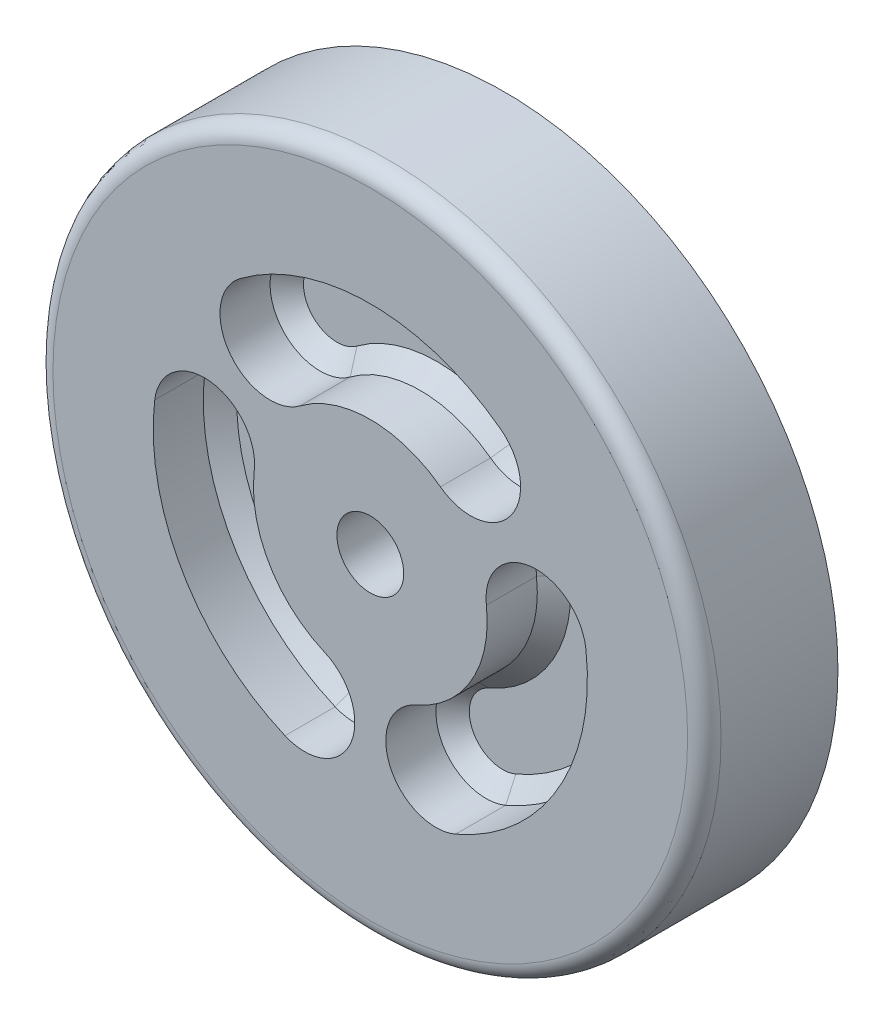
ISO-10303-21;
HEADER;
FILE_DESCRIPTION(('STEP AP214'),'2;1');
FILE_NAME('part.step','',(''),(''),'','','');
FILE_SCHEMA(('AUTOMOTIVE_DESIGN { 1 0 10303 214 1 1 1 1 }'));
ENDSEC;
DATA;
#1=APPLICATION_CONTEXT('core data for automotive mechanical design processes');
#2=APPLICATION_PROTOCOL_DEFINITION('international standard','automotive_design',2000,#1);
#3=PRODUCT_CONTEXT('',#1,'mechanical');
#4=PRODUCT('Part','Part','',(#3));
#5=PRODUCT_RELATED_PRODUCT_CATEGORY('part','',(#4));
#6=PRODUCT_DEFINITION_FORMATION('','',#4);
#7=PRODUCT_DEFINITION_CONTEXT('part definition',#1,'design');
#8=PRODUCT_DEFINITION('design','',#6,#7);
#9=PRODUCT_DEFINITION_SHAPE('','',#8);
#10=(LENGTH_UNIT() NAMED_UNIT(*) SI_UNIT(.MILLI.,.METRE.));
#11=(NAMED_UNIT(*) PLANE_ANGLE_UNIT() SI_UNIT($,.RADIAN.));
#12=(NAMED_UNIT(*) SI_UNIT($,.STERADIAN.) SOLID_ANGLE_UNIT());
#13=UNCERTAINTY_MEASURE_WITH_UNIT(LENGTH_MEASURE(1.E-05),#10,'distance_accuracy_value','');
#14=(GEOMETRIC_REPRESENTATION_CONTEXT(3) GLOBAL_UNCERTAINTY_ASSIGNED_CONTEXT((#13)) GLOBAL_UNIT_ASSIGNED_CONTEXT((#10,
#11,#12)) REPRESENTATION_CONTEXT('',''));
#15=CARTESIAN_POINT('',(0.,0.,0.));
#16=DIRECTION('',(0.,0.,1.));
#17=DIRECTION('',(1.,0.,0.));
#18=AXIS2_PLACEMENT_3D('',#15,#16,#17);
#19=CARTESIAN_POINT('',(0.,0.,40.));
#20=DIRECTION('',(0.,0.,-1.));
#21=DIRECTION('',(-1.,0.,0.));
#22=AXIS2_PLACEMENT_3D('',#19,#20,#21);
#23=CYLINDRICAL_SURFACE('',#22,100.);
#24=CARTESIAN_POINT('',(0.,0.,35.));
#25=DIRECTION('',(0.,0.,1.));
#26=DIRECTION('',(1.,0.,0.));
#27=AXIS2_PLACEMENT_3D('',#24,#25,#26);
#28=CIRCLE('',#27,100.);
#29=CARTESIAN_POINT('',(100.,0.,35.));
#30=VERTEX_POINT('',#29);
#31=EDGE_CURVE('E267',#30,#30,#28,.F.);
#32=ORIENTED_EDGE('',*,*,#31,.T.);
#33=EDGE_LOOP('',(#32));
#34=FACE_BOUND('',#33,.T.);
#35=CARTESIAN_POINT('',(0.,0.,0.));
#36=DIRECTION('',(0.,0.,1.));
#37=DIRECTION('',(1.,0.,0.));
#38=AXIS2_PLACEMENT_3D('',#35,#36,#37);
#39=CIRCLE('',#38,100.);
#40=CARTESIAN_POINT('',(100.,0.,0.));
#41=VERTEX_POINT('',#40);
#42=EDGE_CURVE('E198',#41,#41,#39,.T.);
#43=ORIENTED_EDGE('',*,*,#42,.T.);
#44=EDGE_LOOP('',(#43));
#45=FACE_BOUND('',#44,.T.);
#46=ADVANCED_FACE('F41',(#34,#45),#23,.T.);
#47=CARTESIAN_POINT('',(0.,0.,40.));
#48=DIRECTION('',(0.,0.,1.));
#49=DIRECTION('',(1.,0.,0.));
#50=AXIS2_PLACEMENT_3D('',#47,#48,#49);
#51=PLANE('',#50);
#52=CARTESIAN_POINT('',(0.,0.,40.));
#53=DIRECTION('',(0.,0.,1.));
#54=DIRECTION('',(1.,0.,0.));
#55=AXIS2_PLACEMENT_3D('',#52,#53,#54);
#56=CIRCLE('',#55,10.);
#57=CARTESIAN_POINT('',(10.,0.,40.));
#58=VERTEX_POINT('',#57);
#59=EDGE_CURVE('E749',#58,#58,#56,.T.);
#60=ORIENTED_EDGE('',*,*,#59,.F.);
#61=EDGE_LOOP('',(#60));
#62=FACE_BOUND('',#61,.T.);
#63=CARTESIAN_POINT('',(0.,0.,40.));
#64=DIRECTION('',(0.,0.,1.));
#65=DIRECTION('',(1.,0.,0.));
#66=AXIS2_PLACEMENT_3D('',#63,#64,#65);
#67=CIRCLE('',#66,95.);
#68=CARTESIAN_POINT('',(95.,0.,40.));
#69=VERTEX_POINT('',#68);
#70=EDGE_CURVE('E263',#69,#69,#67,.T.);
#71=ORIENTED_EDGE('',*,*,#70,.T.);
#72=EDGE_LOOP('',(#71));
#73=FACE_BOUND('',#72,.T.);
#74=CARTESIAN_POINT('',(30.,40.,40.));
#75=DIRECTION('',(0.,0.,1.));
#76=DIRECTION('',(1.,0.,0.));
#77=AXIS2_PLACEMENT_3D('',#74,#75,#76);
#78=CIRCLE('',#77,15.);
#79=CARTESIAN_POINT('',(21.,28.,40.));
#80=VERTEX_POINT('',#79);
#81=CARTESIAN_POINT('',(39.,52.,40.));
#82=VERTEX_POINT('',#81);
#83=EDGE_CURVE('E183',#80,#82,#78,.T.);
#84=ORIENTED_EDGE('',*,*,#83,.F.);
#85=CARTESIAN_POINT('',(0.,0.,40.));
#86=DIRECTION('',(0.,0.,-1.));
#87=DIRECTION('',(1.,0.,0.));
#88=AXIS2_PLACEMENT_3D('',#85,#86,#87);
#89=CIRCLE('',#88,35.);
#90=CARTESIAN_POINT('',(-21.,28.,40.));
#91=VERTEX_POINT('',#90);
#92=EDGE_CURVE('E188',#91,#80,#89,.T.);
#93=ORIENTED_EDGE('',*,*,#92,.F.);
#94=CARTESIAN_POINT('',(-30.,40.,40.));
#95=DIRECTION('',(0.,0.,1.));
#96=DIRECTION('',(1.,0.,0.));
#97=AXIS2_PLACEMENT_3D('',#94,#95,#96);
#98=CIRCLE('',#97,15.);
#99=CARTESIAN_POINT('',(-39.,52.,40.));
#100=VERTEX_POINT('',#99);
#101=EDGE_CURVE('E170',#100,#91,#98,.T.);
#102=ORIENTED_EDGE('',*,*,#101,.F.);
#103=CARTESIAN_POINT('',(0.,0.,40.));
#104=DIRECTION('',(0.,0.,1.));
#105=DIRECTION('',(1.,0.,0.));
#106=AXIS2_PLACEMENT_3D('',#103,#104,#105);
#107=CIRCLE('',#106,65.);
#108=EDGE_CURVE('E177',#82,#100,#107,.T.);
#109=ORIENTED_EDGE('',*,*,#108,.F.);
#110=EDGE_LOOP('',(#84,#93,#102,#109));
#111=FACE_BOUND('',#110,.T.);
#112=CARTESIAN_POINT('',(19.6410161513776,-45.9807621135332,40.));
#113=DIRECTION('',(0.,0.,1.));
#114=DIRECTION('',(1.,0.,0.));
#115=AXIS2_PLACEMENT_3D('',#112,#113,#114);
#116=CIRCLE('',#115,15.);
#117=CARTESIAN_POINT('',(13.7487113059643,-32.1865334794732,40.));
#118=VERTEX_POINT('',#117);
#119=CARTESIAN_POINT('',(25.5333209967908,-59.7749907475931,40.));
#120=VERTEX_POINT('',#119);
#121=EDGE_CURVE('E203',#118,#120,#116,.T.);
#122=ORIENTED_EDGE('',*,*,#121,.F.);
#123=CARTESIAN_POINT('',(0.,0.,40.));
#124=DIRECTION('',(0.,0.,-1.));
#125=DIRECTION('',(1.,0.,0.));
#126=AXIS2_PLACEMENT_3D('',#123,#124,#125);
#127=CIRCLE('',#126,35.);
#128=CARTESIAN_POINT('',(34.7487113059643,4.18653347947322,40.));
#129=VERTEX_POINT('',#128);
#130=EDGE_CURVE('E216',#129,#118,#127,.T.);
#131=ORIENTED_EDGE('',*,*,#130,.F.);
#132=CARTESIAN_POINT('',(49.6410161513775,5.98076211353317,40.));
#133=DIRECTION('',(0.,0.,1.));
#134=DIRECTION('',(1.,0.,0.));
#135=AXIS2_PLACEMENT_3D('',#132,#133,#134);
#136=CIRCLE('',#135,15.);
#137=CARTESIAN_POINT('',(64.5333209967908,7.77499074759314,40.));
#138=VERTEX_POINT('',#137);
#139=EDGE_CURVE('E212',#138,#129,#136,.T.);
#140=ORIENTED_EDGE('',*,*,#139,.F.);
#141=CARTESIAN_POINT('',(0.,0.,40.));
#142=DIRECTION('',(0.,0.,1.));
#143=DIRECTION('',(1.,0.,0.));
#144=AXIS2_PLACEMENT_3D('',#141,#142,#143);
#145=CIRCLE('',#144,65.);
#146=EDGE_CURVE('E207',#120,#138,#145,.T.);
#147=ORIENTED_EDGE('',*,*,#146,.F.);
#148=EDGE_LOOP('',(#122,#131,#140,#147));
#149=FACE_BOUND('',#148,.T.);
#150=CARTESIAN_POINT('',(-49.6410161513775,5.98076211353315,40.));
#151=DIRECTION('',(0.,0.,1.));
#152=DIRECTION('',(1.,0.,0.));
#153=AXIS2_PLACEMENT_3D('',#150,#151,#152);
#154=CIRCLE('',#153,15.);
#155=CARTESIAN_POINT('',(-34.7487113059643,4.1865334794732,40.));
#156=VERTEX_POINT('',#155);
#157=CARTESIAN_POINT('',(-64.5333209967908,7.77499074759309,40.));
#158=VERTEX_POINT('',#157);
#159=EDGE_CURVE('E232',#156,#158,#154,.T.);
#160=ORIENTED_EDGE('',*,*,#159,.F.);
#161=CARTESIAN_POINT('',(0.,0.,40.));
#162=DIRECTION('',(0.,0.,-1.));
#163=DIRECTION('',(1.,0.,0.));
#164=AXIS2_PLACEMENT_3D('',#161,#162,#163);
#165=CIRCLE('',#164,35.);
#166=CARTESIAN_POINT('',(-13.7487113059643,-32.1865334794732,40.));
#167=VERTEX_POINT('',#166);
#168=EDGE_CURVE('E245',#167,#156,#165,.T.);
#169=ORIENTED_EDGE('',*,*,#168,.F.);
#170=CARTESIAN_POINT('',(-19.6410161513775,-45.9807621135332,40.));
#171=DIRECTION('',(0.,0.,1.));
#172=DIRECTION('',(1.,0.,0.));
#173=AXIS2_PLACEMENT_3D('',#170,#171,#172);
#174=CIRCLE('',#173,15.);
#175=CARTESIAN_POINT('',(-25.5333209967908,-59.7749907475931,40.));
#176=VERTEX_POINT('',#175);
#177=EDGE_CURVE('E241',#176,#167,#174,.T.);
#178=ORIENTED_EDGE('',*,*,#177,.F.);
#179=CARTESIAN_POINT('',(0.,0.,40.));
#180=DIRECTION('',(0.,0.,1.));
#181=DIRECTION('',(1.,0.,0.));
#182=AXIS2_PLACEMENT_3D('',#179,#180,#181);
#183=CIRCLE('',#182,65.);
#184=EDGE_CURVE('E236',#158,#176,#183,.T.);
#185=ORIENTED_EDGE('',*,*,#184,.F.);
#186=EDGE_LOOP('',(#160,#169,#178,#185));
#187=FACE_BOUND('',#186,.T.);
#188=ADVANCED_FACE('F185',(#62,#73,#111,#149,#187),#51,.T.);
#189=CARTESIAN_POINT('',(0.,0.,0.));
#190=DIRECTION('',(0.,0.,1.));
#191=DIRECTION('',(1.,0.,0.));
#192=AXIS2_PLACEMENT_3D('',#189,#190,#191);
#193=PLANE('',#192);
#194=CARTESIAN_POINT('',(0.,0.,0.));
#195=DIRECTION('',(0.,0.,1.));
#196=DIRECTION('',(1.,0.,0.));
#197=AXIS2_PLACEMENT_3D('',#194,#195,#196);
#198=CIRCLE('',#197,10.);
#199=CARTESIAN_POINT('',(10.,0.,0.));
#200=VERTEX_POINT('',#199);
#201=EDGE_CURVE('E375',#200,#200,#198,.T.);
#202=ORIENTED_EDGE('',*,*,#201,.T.);
#203=EDGE_LOOP('',(#202));
#204=FACE_BOUND('',#203,.T.);
#205=ORIENTED_EDGE('',*,*,#42,.F.);
#206=EDGE_LOOP('',(#205));
#207=FACE_BOUND('',#206,.T.);
#208=ADVANCED_FACE('F426',(#204,#207),#193,.F.);
#209=CARTESIAN_POINT('',(-49.6410161513775,5.98076211353315,20.));
#210=DIRECTION('',(0.,0.,1.));
#211=DIRECTION('',(1.,0.,0.));
#212=AXIS2_PLACEMENT_3D('',#209,#210,#211);
#213=CYLINDRICAL_SURFACE('',#212,15.);
#214=DIRECTION('',(0.,0.,1.));
#215=VECTOR('',#214,1.);
#216=CARTESIAN_POINT('',(-64.5333209967908,7.77499074759309,20.));
#217=LINE('',#216,#215);
#218=CARTESIAN_POINT('',(-64.5333209967908,7.77499074759309,24.9999999999999));
#219=VERTEX_POINT('',#218);
#220=EDGE_CURVE('E249',#219,#158,#217,.T.);
#221=ORIENTED_EDGE('',*,*,#220,.F.);
#222=CARTESIAN_POINT('',(-49.6410161513775,5.98076211353315,24.9999999999999));
#223=DIRECTION('',(0.,0.,1.));
#224=DIRECTION('',(1.,0.,0.));
#225=AXIS2_PLACEMENT_3D('',#222,#223,#224);
#226=CIRCLE('',#225,15.);
#227=CARTESIAN_POINT('',(-34.7487113059643,4.1865334794732,24.9999999999999));
#228=VERTEX_POINT('',#227);
#229=EDGE_CURVE('E294',#219,#228,#226,.F.);
#230=ORIENTED_EDGE('',*,*,#229,.T.);
#231=DIRECTION('',(0.,0.,1.));
#232=VECTOR('',#231,1.);
#233=CARTESIAN_POINT('',(-34.7487113059643,4.1865334794732,20.));
#234=LINE('',#233,#232);
#235=EDGE_CURVE('E208',#228,#156,#234,.T.);
#236=ORIENTED_EDGE('',*,*,#235,.T.);
#237=ORIENTED_EDGE('',*,*,#159,.T.);
#238=EDGE_LOOP('',(#221,#230,#236,#237));
#239=FACE_BOUND('',#238,.T.);
#240=ADVANCED_FACE('F517',(#239),#213,.F.);
#241=CARTESIAN_POINT('',(0.,0.,20.));
#242=DIRECTION('',(0.,0.,1.));
#243=DIRECTION('',(1.,0.,0.));
#244=AXIS2_PLACEMENT_3D('',#241,#242,#243);
#245=CYLINDRICAL_SURFACE('',#244,35.);
#246=ORIENTED_EDGE('',*,*,#235,.F.);
#247=CARTESIAN_POINT('',(0.,0.,24.9999999999999));
#248=DIRECTION('',(0.,0.,1.));
#249=DIRECTION('',(1.,0.,0.));
#250=AXIS2_PLACEMENT_3D('',#247,#248,#249);
#251=CIRCLE('',#250,35.);
#252=CARTESIAN_POINT('',(-13.7487113059643,-32.1865334794732,24.9999999999999));
#253=VERTEX_POINT('',#252);
#254=EDGE_CURVE('E284',#228,#253,#251,.T.);
#255=ORIENTED_EDGE('',*,*,#254,.T.);
#256=DIRECTION('',(0.,0.,1.));
#257=VECTOR('',#256,1.);
#258=CARTESIAN_POINT('',(-13.7487113059643,-32.1865334794732,20.));
#259=LINE('',#258,#257);
#260=EDGE_CURVE('E252',#253,#167,#259,.T.);
#261=ORIENTED_EDGE('',*,*,#260,.T.);
#262=ORIENTED_EDGE('',*,*,#168,.T.);
#263=EDGE_LOOP('',(#246,#255,#261,#262));
#264=FACE_BOUND('',#263,.T.);
#265=ADVANCED_FACE('F522',(#264),#245,.T.);
#266=CARTESIAN_POINT('',(-19.6410161513775,-45.9807621135332,20.));
#267=DIRECTION('',(0.,0.,1.));
#268=DIRECTION('',(1.,0.,0.));
#269=AXIS2_PLACEMENT_3D('',#266,#267,#268);
#270=CYLINDRICAL_SURFACE('',#269,15.);
#271=ORIENTED_EDGE('',*,*,#260,.F.);
#272=CARTESIAN_POINT('',(-19.6410161513775,-45.9807621135332,24.9999999999999));
#273=DIRECTION('',(0.,0.,1.));
#274=DIRECTION('',(1.,0.,0.));
#275=AXIS2_PLACEMENT_3D('',#272,#273,#274);
#276=CIRCLE('',#275,15.);
#277=CARTESIAN_POINT('',(-25.5333209967908,-59.7749907475931,24.9999999999999));
#278=VERTEX_POINT('',#277);
#279=EDGE_CURVE('E288',#253,#278,#276,.F.);
#280=ORIENTED_EDGE('',*,*,#279,.T.);
#281=DIRECTION('',(0.,0.,1.));
#282=VECTOR('',#281,1.);
#283=CARTESIAN_POINT('',(-25.5333209967908,-59.7749907475931,20.));
#284=LINE('',#283,#282);
#285=EDGE_CURVE('E255',#278,#176,#284,.T.);
#286=ORIENTED_EDGE('',*,*,#285,.T.);
#287=ORIENTED_EDGE('',*,*,#177,.T.);
#288=EDGE_LOOP('',(#271,#280,#286,#287));
#289=FACE_BOUND('',#288,.T.);
#290=ADVANCED_FACE('F534',(#289),#270,.F.);
#291=CARTESIAN_POINT('',(0.,0.,20.));
#292=DIRECTION('',(0.,0.,1.));
#293=DIRECTION('',(1.,0.,0.));
#294=AXIS2_PLACEMENT_3D('',#291,#292,#293);
#295=CYLINDRICAL_SURFACE('',#294,65.);
#296=ORIENTED_EDGE('',*,*,#285,.F.);
#297=CARTESIAN_POINT('',(0.,0.,24.9999999999999));
#298=DIRECTION('',(0.,0.,1.));
#299=DIRECTION('',(1.,0.,0.));
#300=AXIS2_PLACEMENT_3D('',#297,#298,#299);
#301=CIRCLE('',#300,65.);
#302=EDGE_CURVE('E291',#278,#219,#301,.F.);
#303=ORIENTED_EDGE('',*,*,#302,.T.);
#304=ORIENTED_EDGE('',*,*,#220,.T.);
#305=ORIENTED_EDGE('',*,*,#184,.T.);
#306=EDGE_LOOP('',(#296,#303,#304,#305));
#307=FACE_BOUND('',#306,.T.);
#308=ADVANCED_FACE('F544',(#307),#295,.F.);
#309=CARTESIAN_POINT('',(-24.8205080756888,2.99038105676658,20.));
#310=DIRECTION('',(0.,0.,1.));
#311=DIRECTION('',(1.,0.,0.));
#312=AXIS2_PLACEMENT_3D('',#309,#310,#311);
#313=PLANE('',#312);
#314=CARTESIAN_POINT('',(-19.6410161513775,-45.9807621135332,20.));
#315=DIRECTION('',(0.,0.,1.));
#316=DIRECTION('',(1.,0.,0.));
#317=AXIS2_PLACEMENT_3D('',#314,#315,#316);
#318=CIRCLE('',#317,10.);
#319=CARTESIAN_POINT('',(-23.5692193816531,-55.1769145362398,20.));
#320=VERTEX_POINT('',#319);
#321=CARTESIAN_POINT('',(-15.712812921102,-36.7846096908265,20.));
#322=VERTEX_POINT('',#321);
#323=EDGE_CURVE('E277',#320,#322,#318,.T.);
#324=ORIENTED_EDGE('',*,*,#323,.T.);
#325=CARTESIAN_POINT('',(0.,0.,20.));
#326=DIRECTION('',(0.,0.,1.));
#327=DIRECTION('',(1.,0.,0.));
#328=AXIS2_PLACEMENT_3D('',#325,#326,#327);
#329=CIRCLE('',#328,40.);
#330=CARTESIAN_POINT('',(-39.712812921102,4.78460969082651,20.));
#331=VERTEX_POINT('',#330);
#332=EDGE_CURVE('E280',#322,#331,#329,.F.);
#333=ORIENTED_EDGE('',*,*,#332,.T.);
#334=CARTESIAN_POINT('',(-49.6410161513775,5.98076211353315,20.));
#335=DIRECTION('',(0.,0.,1.));
#336=DIRECTION('',(1.,0.,0.));
#337=AXIS2_PLACEMENT_3D('',#334,#335,#336);
#338=CIRCLE('',#337,10.);
#339=CARTESIAN_POINT('',(-59.5692193816531,7.17691453623977,20.));
#340=VERTEX_POINT('',#339);
#341=EDGE_CURVE('E271',#331,#340,#338,.T.);
#342=ORIENTED_EDGE('',*,*,#341,.T.);
#343=CARTESIAN_POINT('',(0.,0.,20.));
#344=DIRECTION('',(0.,0.,1.));
#345=DIRECTION('',(1.,0.,0.));
#346=AXIS2_PLACEMENT_3D('',#343,#344,#345);
#347=CIRCLE('',#346,60.);
#348=EDGE_CURVE('E274',#340,#320,#347,.T.);
#349=ORIENTED_EDGE('',*,*,#348,.T.);
#350=EDGE_LOOP('',(#324,#333,#342,#349));
#351=FACE_BOUND('',#350,.T.);
#352=ADVANCED_FACE('F554',(#351),#313,.T.);
#353=CARTESIAN_POINT('',(19.6410161513776,-45.9807621135332,20.));
#354=DIRECTION('',(0.,0.,1.));
#355=DIRECTION('',(1.,0.,0.));
#356=AXIS2_PLACEMENT_3D('',#353,#354,#355);
#357=CYLINDRICAL_SURFACE('',#356,15.);
#358=DIRECTION('',(0.,0.,1.));
#359=VECTOR('',#358,1.);
#360=CARTESIAN_POINT('',(25.5333209967908,-59.7749907475931,20.));
#361=LINE('',#360,#359);
#362=CARTESIAN_POINT('',(25.5333209967908,-59.7749907475931,25.));
#363=VERTEX_POINT('',#362);
#364=EDGE_CURVE('E220',#363,#120,#361,.T.);
#365=ORIENTED_EDGE('',*,*,#364,.F.);
#366=CARTESIAN_POINT('',(19.6410161513776,-45.9807621135332,25.));
#367=DIRECTION('',(0.,0.,1.));
#368=DIRECTION('',(1.,0.,0.));
#369=AXIS2_PLACEMENT_3D('',#366,#367,#368);
#370=CIRCLE('',#369,15.);
#371=CARTESIAN_POINT('',(13.7487113059643,-32.1865334794732,25.));
#372=VERTEX_POINT('',#371);
#373=EDGE_CURVE('E320',#363,#372,#370,.F.);
#374=ORIENTED_EDGE('',*,*,#373,.T.);
#375=DIRECTION('',(0.,0.,1.));
#376=VECTOR('',#375,1.);
#377=CARTESIAN_POINT('',(13.7487113059643,-32.1865334794732,20.));
#378=LINE('',#377,#376);
#379=EDGE_CURVE('E221',#372,#118,#378,.T.);
#380=ORIENTED_EDGE('',*,*,#379,.T.);
#381=ORIENTED_EDGE('',*,*,#121,.T.);
#382=EDGE_LOOP('',(#365,#374,#380,#381));
#383=FACE_BOUND('',#382,.T.);
#384=ADVANCED_FACE('F564',(#383),#357,.F.);
#385=CARTESIAN_POINT('',(0.,0.,20.));
#386=DIRECTION('',(0.,0.,1.));
#387=DIRECTION('',(1.,0.,0.));
#388=AXIS2_PLACEMENT_3D('',#385,#386,#387);
#389=CYLINDRICAL_SURFACE('',#388,35.);
#390=ORIENTED_EDGE('',*,*,#379,.F.);
#391=CARTESIAN_POINT('',(0.,0.,25.));
#392=DIRECTION('',(0.,0.,1.));
#393=DIRECTION('',(1.,0.,0.));
#394=AXIS2_PLACEMENT_3D('',#391,#392,#393);
#395=CIRCLE('',#394,35.);
#396=CARTESIAN_POINT('',(34.7487113059643,4.18653347947322,25.));
#397=VERTEX_POINT('',#396);
#398=EDGE_CURVE('E310',#372,#397,#395,.T.);
#399=ORIENTED_EDGE('',*,*,#398,.T.);
#400=DIRECTION('',(0.,0.,1.));
#401=VECTOR('',#400,1.);
#402=CARTESIAN_POINT('',(34.7487113059643,4.18653347947322,20.));
#403=LINE('',#402,#401);
#404=EDGE_CURVE('E224',#397,#129,#403,.T.);
#405=ORIENTED_EDGE('',*,*,#404,.T.);
#406=ORIENTED_EDGE('',*,*,#130,.T.);
#407=EDGE_LOOP('',(#390,#399,#405,#406));
#408=FACE_BOUND('',#407,.T.);
#409=ADVANCED_FACE('F574',(#408),#389,.T.);
#410=CARTESIAN_POINT('',(49.6410161513775,5.98076211353317,20.));
#411=DIRECTION('',(0.,0.,1.));
#412=DIRECTION('',(1.,0.,0.));
#413=AXIS2_PLACEMENT_3D('',#410,#411,#412);
#414=CYLINDRICAL_SURFACE('',#413,15.);
#415=ORIENTED_EDGE('',*,*,#404,.F.);
#416=CARTESIAN_POINT('',(49.6410161513775,5.98076211353317,25.));
#417=DIRECTION('',(0.,0.,1.));
#418=DIRECTION('',(1.,0.,0.));
#419=AXIS2_PLACEMENT_3D('',#416,#417,#418);
#420=CIRCLE('',#419,15.);
#421=CARTESIAN_POINT('',(64.5333209967908,7.77499074759314,25.));
#422=VERTEX_POINT('',#421);
#423=EDGE_CURVE('E314',#397,#422,#420,.F.);
#424=ORIENTED_EDGE('',*,*,#423,.T.);
#425=DIRECTION('',(0.,0.,1.));
#426=VECTOR('',#425,1.);
#427=CARTESIAN_POINT('',(64.5333209967908,7.77499074759314,20.));
#428=LINE('',#427,#426);
#429=EDGE_CURVE('E227',#422,#138,#428,.T.);
#430=ORIENTED_EDGE('',*,*,#429,.T.);
#431=ORIENTED_EDGE('',*,*,#139,.T.);
#432=EDGE_LOOP('',(#415,#424,#430,#431));
#433=FACE_BOUND('',#432,.T.);
#434=ADVANCED_FACE('F584',(#433),#414,.F.);
#435=CARTESIAN_POINT('',(0.,0.,20.));
#436=DIRECTION('',(0.,0.,1.));
#437=DIRECTION('',(1.,0.,0.));
#438=AXIS2_PLACEMENT_3D('',#435,#436,#437);
#439=CYLINDRICAL_SURFACE('',#438,65.);
#440=ORIENTED_EDGE('',*,*,#429,.F.);
#441=CARTESIAN_POINT('',(0.,0.,25.));
#442=DIRECTION('',(0.,0.,1.));
#443=DIRECTION('',(1.,0.,0.));
#444=AXIS2_PLACEMENT_3D('',#441,#442,#443);
#445=CIRCLE('',#444,65.);
#446=EDGE_CURVE('E317',#422,#363,#445,.F.);
#447=ORIENTED_EDGE('',*,*,#446,.T.);
#448=ORIENTED_EDGE('',*,*,#364,.T.);
#449=ORIENTED_EDGE('',*,*,#146,.T.);
#450=EDGE_LOOP('',(#440,#447,#448,#449));
#451=FACE_BOUND('',#450,.T.);
#452=ADVANCED_FACE('F594',(#451),#439,.F.);
#453=CARTESIAN_POINT('',(9.82050807568878,-22.9903810567666,20.));
#454=DIRECTION('',(0.,0.,1.));
#455=DIRECTION('',(1.,0.,0.));
#456=AXIS2_PLACEMENT_3D('',#453,#454,#455);
#457=PLANE('',#456);
#458=CARTESIAN_POINT('',(49.6410161513775,5.98076211353317,20.));
#459=DIRECTION('',(0.,0.,1.));
#460=DIRECTION('',(1.,0.,0.));
#461=AXIS2_PLACEMENT_3D('',#458,#459,#460);
#462=CIRCLE('',#461,9.99999999999994);
#463=CARTESIAN_POINT('',(59.569219381653,7.17691453623981,20.));
#464=VERTEX_POINT('',#463);
#465=CARTESIAN_POINT('',(39.7128129211021,4.78460969082655,20.));
#466=VERTEX_POINT('',#465);
#467=EDGE_CURVE('E303',#464,#466,#462,.T.);
#468=ORIENTED_EDGE('',*,*,#467,.T.);
#469=CARTESIAN_POINT('',(0.,0.,20.));
#470=DIRECTION('',(0.,0.,1.));
#471=DIRECTION('',(1.,0.,0.));
#472=AXIS2_PLACEMENT_3D('',#469,#470,#471);
#473=CIRCLE('',#472,40.0000000000001);
#474=CARTESIAN_POINT('',(15.7128129211021,-36.7846096908266,20.));
#475=VERTEX_POINT('',#474);
#476=EDGE_CURVE('E306',#466,#475,#473,.F.);
#477=ORIENTED_EDGE('',*,*,#476,.T.);
#478=CARTESIAN_POINT('',(19.6410161513776,-45.9807621135332,20.));
#479=DIRECTION('',(0.,0.,1.));
#480=DIRECTION('',(1.,0.,0.));
#481=AXIS2_PLACEMENT_3D('',#478,#479,#480);
#482=CIRCLE('',#481,9.99999999999994);
#483=CARTESIAN_POINT('',(23.5692193816531,-55.1769145362397,20.));
#484=VERTEX_POINT('',#483);
#485=EDGE_CURVE('E297',#475,#484,#482,.T.);
#486=ORIENTED_EDGE('',*,*,#485,.T.);
#487=CARTESIAN_POINT('',(0.,0.,20.));
#488=DIRECTION('',(0.,0.,1.));
#489=DIRECTION('',(1.,0.,0.));
#490=AXIS2_PLACEMENT_3D('',#487,#488,#489);
#491=CIRCLE('',#490,59.9999999999999);
#492=EDGE_CURVE('E300',#484,#464,#491,.T.);
#493=ORIENTED_EDGE('',*,*,#492,.T.);
#494=EDGE_LOOP('',(#468,#477,#486,#493));
#495=FACE_BOUND('',#494,.T.);
#496=ADVANCED_FACE('F604',(#495),#457,.T.);
#497=CARTESIAN_POINT('',(30.,40.,20.));
#498=DIRECTION('',(0.,0.,1.));
#499=DIRECTION('',(1.,0.,0.));
#500=AXIS2_PLACEMENT_3D('',#497,#498,#499);
#501=CYLINDRICAL_SURFACE('',#500,15.);
#502=DIRECTION('',(0.,0.,1.));
#503=VECTOR('',#502,1.);
#504=CARTESIAN_POINT('',(39.,52.,20.));
#505=LINE('',#504,#503);
#506=CARTESIAN_POINT('',(39.,52.,25.));
#507=VERTEX_POINT('',#506);
#508=EDGE_CURVE('E174',#507,#82,#505,.T.);
#509=ORIENTED_EDGE('',*,*,#508,.F.);
#510=CARTESIAN_POINT('',(30.,40.,25.));
#511=DIRECTION('',(0.,0.,1.));
#512=DIRECTION('',(1.,0.,0.));
#513=AXIS2_PLACEMENT_3D('',#510,#511,#512);
#514=CIRCLE('',#513,15.);
#515=CARTESIAN_POINT('',(21.,28.,25.));
#516=VERTEX_POINT('',#515);
#517=EDGE_CURVE('E11',#507,#516,#514,.F.);
#518=ORIENTED_EDGE('',*,*,#517,.T.);
#519=DIRECTION('',(0.,0.,1.));
#520=VECTOR('',#519,1.);
#521=CARTESIAN_POINT('',(21.,28.,20.));
#522=LINE('',#521,#520);
#523=EDGE_CURVE('E195',#516,#80,#522,.T.);
#524=ORIENTED_EDGE('',*,*,#523,.T.);
#525=ORIENTED_EDGE('',*,*,#83,.T.);
#526=EDGE_LOOP('',(#509,#518,#524,#525));
#527=FACE_BOUND('',#526,.T.);
#528=ADVANCED_FACE('F397',(#527),#501,.F.);
#529=CARTESIAN_POINT('',(0.,0.,20.));
#530=DIRECTION('',(0.,0.,1.));
#531=DIRECTION('',(1.,0.,0.));
#532=AXIS2_PLACEMENT_3D('',#529,#530,#531);
#533=CYLINDRICAL_SURFACE('',#532,35.);
#534=ORIENTED_EDGE('',*,*,#523,.F.);
#535=CARTESIAN_POINT('',(0.,0.,25.));
#536=DIRECTION('',(0.,0.,1.));
#537=DIRECTION('',(1.,0.,0.));
#538=AXIS2_PLACEMENT_3D('',#535,#536,#537);
#539=CIRCLE('',#538,35.);
#540=CARTESIAN_POINT('',(-21.,28.,25.));
#541=VERTEX_POINT('',#540);
#542=EDGE_CURVE('E336',#516,#541,#539,.T.);
#543=ORIENTED_EDGE('',*,*,#542,.T.);
#544=DIRECTION('',(0.,0.,1.));
#545=VECTOR('',#544,1.);
#546=CARTESIAN_POINT('',(-21.,28.,20.));
#547=LINE('',#546,#545);
#548=EDGE_CURVE('E173',#541,#91,#547,.T.);
#549=ORIENTED_EDGE('',*,*,#548,.T.);
#550=ORIENTED_EDGE('',*,*,#92,.T.);
#551=EDGE_LOOP('',(#534,#543,#549,#550));
#552=FACE_BOUND('',#551,.T.);
#553=ADVANCED_FACE('F400',(#552),#533,.T.);
#554=CARTESIAN_POINT('',(-30.,40.,20.));
#555=DIRECTION('',(0.,0.,1.));
#556=DIRECTION('',(1.,0.,0.));
#557=AXIS2_PLACEMENT_3D('',#554,#555,#556);
#558=CYLINDRICAL_SURFACE('',#557,15.);
#559=ORIENTED_EDGE('',*,*,#548,.F.);
#560=CARTESIAN_POINT('',(-30.,40.,25.));
#561=DIRECTION('',(0.,0.,1.));
#562=DIRECTION('',(1.,0.,0.));
#563=AXIS2_PLACEMENT_3D('',#560,#561,#562);
#564=CIRCLE('',#563,15.);
#565=CARTESIAN_POINT('',(-39.,52.,25.));
#566=VERTEX_POINT('',#565);
#567=EDGE_CURVE('E66',#541,#566,#564,.F.);
#568=ORIENTED_EDGE('',*,*,#567,.T.);
#569=DIRECTION('',(0.,0.,1.));
#570=VECTOR('',#569,1.);
#571=CARTESIAN_POINT('',(-39.,52.,20.));
#572=LINE('',#571,#570);
#573=EDGE_CURVE('E166',#566,#100,#572,.T.);
#574=ORIENTED_EDGE('',*,*,#573,.T.);
#575=ORIENTED_EDGE('',*,*,#101,.T.);
#576=EDGE_LOOP('',(#559,#568,#574,#575));
#577=FACE_BOUND('',#576,.T.);
#578=ADVANCED_FACE('F168',(#577),#558,.F.);
#579=CARTESIAN_POINT('',(0.,0.,20.));
#580=DIRECTION('',(0.,0.,1.));
#581=DIRECTION('',(1.,0.,0.));
#582=AXIS2_PLACEMENT_3D('',#579,#580,#581);
#583=CYLINDRICAL_SURFACE('',#582,65.);
#584=ORIENTED_EDGE('',*,*,#573,.F.);
#585=CARTESIAN_POINT('',(0.,0.,25.));
#586=DIRECTION('',(0.,0.,1.));
#587=DIRECTION('',(1.,0.,0.));
#588=AXIS2_PLACEMENT_3D('',#585,#586,#587);
#589=CIRCLE('',#588,65.);
#590=EDGE_CURVE('E51',#566,#507,#589,.F.);
#591=ORIENTED_EDGE('',*,*,#590,.T.);
#592=ORIENTED_EDGE('',*,*,#508,.T.);
#593=ORIENTED_EDGE('',*,*,#108,.T.);
#594=EDGE_LOOP('',(#584,#591,#592,#593));
#595=FACE_BOUND('',#594,.T.);
#596=ADVANCED_FACE('F178',(#595),#583,.F.);
#597=CARTESIAN_POINT('',(15.,20.,20.));
#598=DIRECTION('',(0.,0.,1.));
#599=DIRECTION('',(1.,0.,0.));
#600=AXIS2_PLACEMENT_3D('',#597,#598,#599);
#601=PLANE('',#600);
#602=CARTESIAN_POINT('',(-30.,40.,20.));
#603=DIRECTION('',(0.,0.,1.));
#604=DIRECTION('',(1.,0.,0.));
#605=AXIS2_PLACEMENT_3D('',#602,#603,#604);
#606=CIRCLE('',#605,9.99999999999998);
#607=CARTESIAN_POINT('',(-36.,48.,20.));
#608=VERTEX_POINT('',#607);
#609=CARTESIAN_POINT('',(-24.,32.,20.));
#610=VERTEX_POINT('',#609);
#611=EDGE_CURVE('E329',#608,#610,#606,.T.);
#612=ORIENTED_EDGE('',*,*,#611,.T.);
#613=CARTESIAN_POINT('',(0.,0.,20.));
#614=DIRECTION('',(0.,0.,1.));
#615=DIRECTION('',(1.,0.,0.));
#616=AXIS2_PLACEMENT_3D('',#613,#614,#615);
#617=CIRCLE('',#616,40.);
#618=CARTESIAN_POINT('',(24.,32.,20.));
#619=VERTEX_POINT('',#618);
#620=EDGE_CURVE('E332',#610,#619,#617,.F.);
#621=ORIENTED_EDGE('',*,*,#620,.T.);
#622=CARTESIAN_POINT('',(30.,40.,20.));
#623=DIRECTION('',(0.,0.,1.));
#624=DIRECTION('',(1.,0.,0.));
#625=AXIS2_PLACEMENT_3D('',#622,#623,#624);
#626=CIRCLE('',#625,9.99999999999998);
#627=CARTESIAN_POINT('',(36.,48.,20.));
#628=VERTEX_POINT('',#627);
#629=EDGE_CURVE('E323',#619,#628,#626,.T.);
#630=ORIENTED_EDGE('',*,*,#629,.T.);
#631=CARTESIAN_POINT('',(0.,0.,20.));
#632=DIRECTION('',(0.,0.,1.));
#633=DIRECTION('',(1.,0.,0.));
#634=AXIS2_PLACEMENT_3D('',#631,#632,#633);
#635=CIRCLE('',#634,60.);
#636=EDGE_CURVE('E326',#628,#608,#635,.T.);
#637=ORIENTED_EDGE('',*,*,#636,.T.);
#638=EDGE_LOOP('',(#612,#621,#630,#637));
#639=FACE_BOUND('',#638,.T.);
#640=ADVANCED_FACE('F405',(#639),#601,.T.);
#641=CARTESIAN_POINT('',(0.,0.,35.));
#642=DIRECTION('',(0.,0.,1.));
#643=DIRECTION('',(1.,0.,0.));
#644=AXIS2_PLACEMENT_3D('',#641,#642,#643);
#645=TOROIDAL_SURFACE('',#644,95.,5.);
#646=ORIENTED_EDGE('',*,*,#31,.F.);
#647=EDGE_LOOP('',(#646));
#648=FACE_BOUND('',#647,.T.);
#649=ORIENTED_EDGE('',*,*,#70,.F.);
#650=EDGE_LOOP('',(#649));
#651=FACE_BOUND('',#650,.T.);
#652=ADVANCED_FACE('F407',(#648,#651),#645,.T.);
#653=CARTESIAN_POINT('',(0.,0.,20.));
#654=DIRECTION('',(0.,0.,1.));
#655=DIRECTION('',(1.,0.,0.));
#656=AXIS2_PLACEMENT_3D('',#653,#654,#655);
#657=CONICAL_SURFACE('',#656,60.,0.785398163397453);
#658=DIRECTION('',(0.702029982912602,-0.0845807489428577,-0.707106781186545));
#659=VECTOR('',#658,1.);
#660=CARTESIAN_POINT('',(-64.5333209967908,7.77499074759309,24.9999999999999));
#661=LINE('',#660,#659);
#662=EDGE_CURVE('E351',#219,#340,#661,.T.);
#663=ORIENTED_EDGE('',*,*,#662,.F.);
#664=ORIENTED_EDGE('',*,*,#302,.F.);
#665=DIRECTION('',(-0.277765914200673,-0.650266173892099,0.707106781186544));
#666=VECTOR('',#665,1.);
#667=CARTESIAN_POINT('',(-23.5692193816531,-55.1769145362398,20.));
#668=LINE('',#667,#666);
#669=EDGE_CURVE('E237',#320,#278,#668,.T.);
#670=ORIENTED_EDGE('',*,*,#669,.F.);
#671=ORIENTED_EDGE('',*,*,#348,.F.);
#672=EDGE_LOOP('',(#663,#664,#670,#671));
#673=FACE_BOUND('',#672,.T.);
#674=ADVANCED_FACE('F413',(#673),#657,.F.);
#675=CARTESIAN_POINT('',(-19.6410161513775,-45.9807621135332,20.));
#676=DIRECTION('',(0.,0.,1.));
#677=DIRECTION('',(1.,0.,0.));
#678=AXIS2_PLACEMENT_3D('',#675,#676,#677);
#679=CONICAL_SURFACE('',#678,10.,0.785398163397453);
#680=ORIENTED_EDGE('',*,*,#669,.T.);
#681=ORIENTED_EDGE('',*,*,#279,.F.);
#682=DIRECTION('',(0.277765914200672,0.650266173892098,0.707106781186545));
#683=VECTOR('',#682,1.);
#684=CARTESIAN_POINT('',(-15.712812921102,-36.7846096908265,20.));
#685=LINE('',#684,#683);
#686=EDGE_CURVE('E347',#322,#253,#685,.T.);
#687=ORIENTED_EDGE('',*,*,#686,.F.);
#688=ORIENTED_EDGE('',*,*,#323,.F.);
#689=EDGE_LOOP('',(#680,#681,#687,#688));
#690=FACE_BOUND('',#689,.T.);
#691=ADVANCED_FACE('F440',(#690),#679,.F.);
#692=CARTESIAN_POINT('',(-49.6410161513775,5.98076211353315,20.));
#693=DIRECTION('',(0.,0.,1.));
#694=DIRECTION('',(1.,0.,0.));
#695=AXIS2_PLACEMENT_3D('',#692,#693,#694);
#696=CONICAL_SURFACE('',#695,10.,0.785398163397453);
#697=ORIENTED_EDGE('',*,*,#662,.T.);
#698=ORIENTED_EDGE('',*,*,#341,.F.);
#699=DIRECTION('',(-0.702029982912603,0.0845807489428578,-0.707106781186544));
#700=VECTOR('',#699,1.);
#701=CARTESIAN_POINT('',(-34.7487113059643,4.1865334794732,24.9999999999999));
#702=LINE('',#701,#700);
#703=EDGE_CURVE('E344',#228,#331,#702,.T.);
#704=ORIENTED_EDGE('',*,*,#703,.F.);
#705=ORIENTED_EDGE('',*,*,#229,.F.);
#706=EDGE_LOOP('',(#697,#698,#704,#705));
#707=FACE_BOUND('',#706,.T.);
#708=ADVANCED_FACE('F436',(#707),#696,.F.);
#709=CARTESIAN_POINT('',(0.,0.,20.));
#710=DIRECTION('',(0.,0.,-1.));
#711=DIRECTION('',(-1.,0.,0.));
#712=AXIS2_PLACEMENT_3D('',#709,#710,#711);
#713=CONICAL_SURFACE('',#712,40.,0.785398163397453);
#714=ORIENTED_EDGE('',*,*,#686,.T.);
#715=ORIENTED_EDGE('',*,*,#254,.F.);
#716=ORIENTED_EDGE('',*,*,#703,.T.);
#717=ORIENTED_EDGE('',*,*,#332,.F.);
#718=EDGE_LOOP('',(#714,#715,#716,#717));
#719=FACE_BOUND('',#718,.T.);
#720=ADVANCED_FACE('F432',(#719),#713,.T.);
#721=CARTESIAN_POINT('',(0.,0.,20.));
#722=DIRECTION('',(0.,0.,1.));
#723=DIRECTION('',(1.,0.,0.));
#724=AXIS2_PLACEMENT_3D('',#721,#722,#723);
#725=CONICAL_SURFACE('',#724,59.9999999999999,0.785398163397455);
#726=DIRECTION('',(-0.277765914200673,0.6502661738921,-0.707106781186543));
#727=VECTOR('',#726,1.);
#728=CARTESIAN_POINT('',(25.5333209967908,-59.7749907475931,25.));
#729=LINE('',#728,#727);
#730=EDGE_CURVE('E364',#363,#484,#729,.T.);
#731=ORIENTED_EDGE('',*,*,#730,.F.);
#732=ORIENTED_EDGE('',*,*,#446,.F.);
#733=DIRECTION('',(0.702029982912604,0.0845807489428592,0.707106781186543));
#734=VECTOR('',#733,1.);
#735=CARTESIAN_POINT('',(59.569219381653,7.17691453623981,20.));
#736=LINE('',#735,#734);
#737=EDGE_CURVE('E348',#464,#422,#736,.T.);
#738=ORIENTED_EDGE('',*,*,#737,.F.);
#739=ORIENTED_EDGE('',*,*,#492,.F.);
#740=EDGE_LOOP('',(#731,#732,#738,#739));
#741=FACE_BOUND('',#740,.T.);
#742=ADVANCED_FACE('F435',(#741),#725,.F.);
#743=CARTESIAN_POINT('',(49.6410161513775,5.98076211353317,20.));
#744=DIRECTION('',(0.,0.,1.));
#745=DIRECTION('',(1.,0.,0.));
#746=AXIS2_PLACEMENT_3D('',#743,#744,#745);
#747=CONICAL_SURFACE('',#746,9.99999999999995,0.785398163397454);
#748=ORIENTED_EDGE('',*,*,#737,.T.);
#749=ORIENTED_EDGE('',*,*,#423,.F.);
#750=DIRECTION('',(-0.702029982912604,-0.0845807489428585,0.707106781186543));
#751=VECTOR('',#750,1.);
#752=CARTESIAN_POINT('',(39.7128129211021,4.78460969082655,20.));
#753=LINE('',#752,#751);
#754=EDGE_CURVE('E361',#466,#397,#753,.T.);
#755=ORIENTED_EDGE('',*,*,#754,.F.);
#756=ORIENTED_EDGE('',*,*,#467,.F.);
#757=EDGE_LOOP('',(#748,#749,#755,#756));
#758=FACE_BOUND('',#757,.T.);
#759=ADVANCED_FACE('F455',(#758),#747,.F.);
#760=CARTESIAN_POINT('',(19.6410161513776,-45.9807621135332,20.));
#761=DIRECTION('',(0.,0.,1.));
#762=DIRECTION('',(1.,0.,0.));
#763=AXIS2_PLACEMENT_3D('',#760,#761,#762);
#764=CONICAL_SURFACE('',#763,9.99999999999994,0.785398163397455);
#765=ORIENTED_EDGE('',*,*,#730,.T.);
#766=ORIENTED_EDGE('',*,*,#485,.F.);
#767=DIRECTION('',(0.277765914200674,-0.6502661738921,-0.707106781186543));
#768=VECTOR('',#767,1.);
#769=CARTESIAN_POINT('',(13.7487113059643,-32.1865334794732,25.));
#770=LINE('',#769,#768);
#771=EDGE_CURVE('E358',#372,#475,#770,.T.);
#772=ORIENTED_EDGE('',*,*,#771,.F.);
#773=ORIENTED_EDGE('',*,*,#373,.F.);
#774=EDGE_LOOP('',(#765,#766,#772,#773));
#775=FACE_BOUND('',#774,.T.);
#776=ADVANCED_FACE('F451',(#775),#764,.F.);
#777=CARTESIAN_POINT('',(0.,0.,20.));
#778=DIRECTION('',(0.,0.,-1.));
#779=DIRECTION('',(-1.,0.,0.));
#780=AXIS2_PLACEMENT_3D('',#777,#778,#779);
#781=CONICAL_SURFACE('',#780,40.0000000000001,0.785398163397455);
#782=ORIENTED_EDGE('',*,*,#754,.T.);
#783=ORIENTED_EDGE('',*,*,#398,.F.);
#784=ORIENTED_EDGE('',*,*,#771,.T.);
#785=ORIENTED_EDGE('',*,*,#476,.F.);
#786=EDGE_LOOP('',(#782,#783,#784,#785));
#787=FACE_BOUND('',#786,.T.);
#788=ADVANCED_FACE('F448',(#787),#781,.T.);
#789=CARTESIAN_POINT('',(0.,0.,20.));
#790=DIRECTION('',(0.,0.,1.));
#791=DIRECTION('',(1.,0.,0.));
#792=AXIS2_PLACEMENT_3D('',#789,#790,#791);
#793=CONICAL_SURFACE('',#792,60.,0.785398163397452);
#794=DIRECTION('',(-0.424264068711931,-0.56568542494924,-0.707106781186544));
#795=VECTOR('',#794,1.);
#796=CARTESIAN_POINT('',(39.,52.,25.));
#797=LINE('',#796,#795);
#798=EDGE_CURVE('E377',#507,#628,#797,.T.);
#799=ORIENTED_EDGE('',*,*,#798,.F.);
#800=ORIENTED_EDGE('',*,*,#590,.F.);
#801=DIRECTION('',(-0.424264068711932,0.56568542494924,0.707106781186545));
#802=VECTOR('',#801,1.);
#803=CARTESIAN_POINT('',(-36.,48.,20.));
#804=LINE('',#803,#802);
#805=EDGE_CURVE('E45',#608,#566,#804,.T.);
#806=ORIENTED_EDGE('',*,*,#805,.F.);
#807=ORIENTED_EDGE('',*,*,#636,.F.);
#808=EDGE_LOOP('',(#799,#800,#806,#807));
#809=FACE_BOUND('',#808,.T.);
#810=ADVANCED_FACE('F43',(#809),#793,.F.);
#811=CARTESIAN_POINT('',(-30.,40.,20.));
#812=DIRECTION('',(0.,0.,1.));
#813=DIRECTION('',(1.,0.,0.));
#814=AXIS2_PLACEMENT_3D('',#811,#812,#813);
#815=CONICAL_SURFACE('',#814,9.99999999999998,0.785398163397453);
#816=ORIENTED_EDGE('',*,*,#805,.T.);
#817=ORIENTED_EDGE('',*,*,#567,.F.);
#818=DIRECTION('',(0.42426406871193,-0.565685424949241,0.707106781186544));
#819=VECTOR('',#818,1.);
#820=CARTESIAN_POINT('',(-24.,32.,20.));
#821=LINE('',#820,#819);
#822=EDGE_CURVE('E374',#610,#541,#821,.T.);
#823=ORIENTED_EDGE('',*,*,#822,.F.);
#824=ORIENTED_EDGE('',*,*,#611,.F.);
#825=EDGE_LOOP('',(#816,#817,#823,#824));
#826=FACE_BOUND('',#825,.T.);
#827=ADVANCED_FACE('F389',(#826),#815,.F.);
#828=CARTESIAN_POINT('',(30.,40.,20.));
#829=DIRECTION('',(0.,0.,1.));
#830=DIRECTION('',(1.,0.,0.));
#831=AXIS2_PLACEMENT_3D('',#828,#829,#830);
#832=CONICAL_SURFACE('',#831,9.99999999999998,0.785398163397453);
#833=ORIENTED_EDGE('',*,*,#798,.T.);
#834=ORIENTED_EDGE('',*,*,#629,.F.);
#835=DIRECTION('',(0.424264068711931,0.56568542494924,-0.707106781186544));
#836=VECTOR('',#835,1.);
#837=CARTESIAN_POINT('',(21.,28.,25.));
#838=LINE('',#837,#836);
#839=EDGE_CURVE('E371',#516,#619,#838,.T.);
#840=ORIENTED_EDGE('',*,*,#839,.F.);
#841=ORIENTED_EDGE('',*,*,#517,.F.);
#842=EDGE_LOOP('',(#833,#834,#840,#841));
#843=FACE_BOUND('',#842,.T.);
#844=ADVANCED_FACE('F394',(#843),#832,.F.);
#845=CARTESIAN_POINT('',(0.,0.,20.));
#846=DIRECTION('',(0.,0.,-1.));
#847=DIRECTION('',(-1.,0.,0.));
#848=AXIS2_PLACEMENT_3D('',#845,#846,#847);
#849=CONICAL_SURFACE('',#848,40.,0.785398163397452);
#850=ORIENTED_EDGE('',*,*,#822,.T.);
#851=ORIENTED_EDGE('',*,*,#542,.F.);
#852=ORIENTED_EDGE('',*,*,#839,.T.);
#853=ORIENTED_EDGE('',*,*,#620,.F.);
#854=EDGE_LOOP('',(#850,#851,#852,#853));
#855=FACE_BOUND('',#854,.T.);
#856=ADVANCED_FACE('F402',(#855),#849,.T.);
#857=CARTESIAN_POINT('',(0.,0.,0.));
#858=DIRECTION('',(0.,0.,1.));
#859=DIRECTION('',(1.,0.,0.));
#860=AXIS2_PLACEMENT_3D('',#857,#858,#859);
#861=CYLINDRICAL_SURFACE('',#860,10.);
#862=ORIENTED_EDGE('',*,*,#201,.F.);
#863=EDGE_LOOP('',(#862));
#864=FACE_BOUND('',#863,.T.);
#865=ORIENTED_EDGE('',*,*,#59,.T.);
#866=EDGE_LOOP('',(#865));
#867=FACE_BOUND('',#866,.T.);
#868=ADVANCED_FACE('F465',(#864,#867),#861,.F.);
#869=CLOSED_SHELL('',(#46,#188,#208,#240,#265,#290,#308,#352,#384,#409,#434,#452,#496,#528,#553,
#578,#596,#640,#652,#674,#691,#708,#720,#742,#759,#776,#788,#810,#827,#844,#856,#868));
#870=MANIFOLD_SOLID_BREP('B2',#869);
#871=ADVANCED_BREP_SHAPE_REPRESENTATION('',(#18,#870),#14);
#872=SHAPE_DEFINITION_REPRESENTATION(#9,#871);
ENDSEC;
END-ISO-10303-21;
